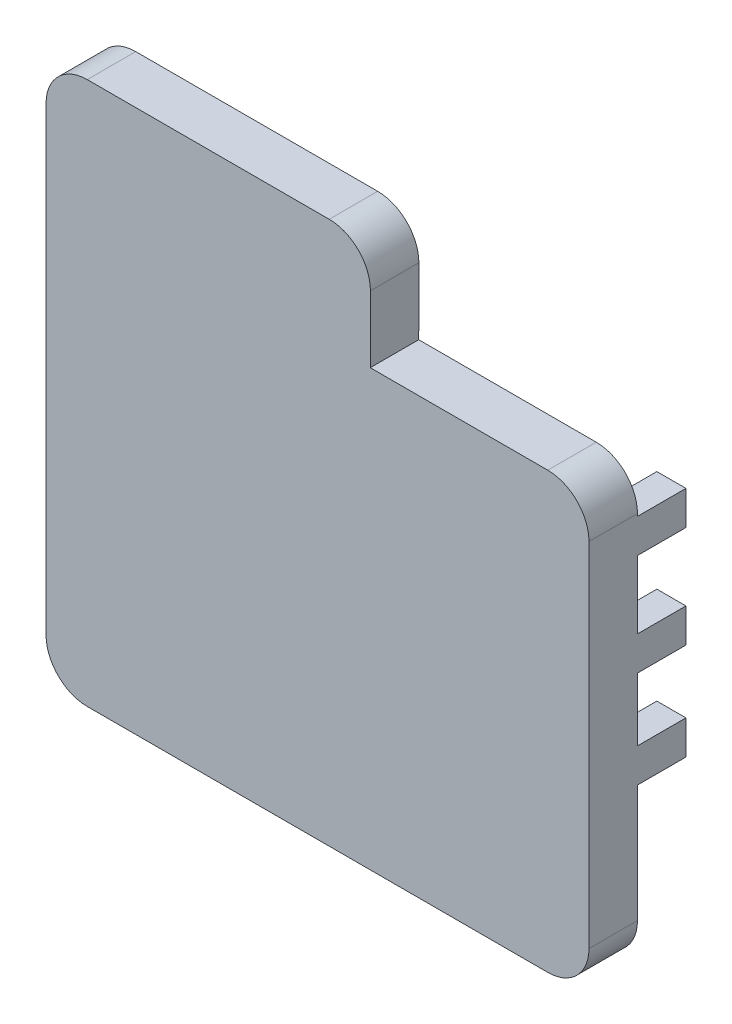
ISO-10303-21;
HEADER;
FILE_DESCRIPTION(('STEP AP214'),'2;1');
FILE_NAME('part.step','',(''),(''),'','','');
FILE_SCHEMA(('AUTOMOTIVE_DESIGN { 1 0 10303 214 1 1 1 1 }'));
ENDSEC;
DATA;
#1=APPLICATION_CONTEXT('core data for automotive mechanical design processes');
#2=APPLICATION_PROTOCOL_DEFINITION('international standard','automotive_design',2000,#1);
#3=PRODUCT_CONTEXT('',#1,'mechanical');
#4=PRODUCT('Part','Part','',(#3));
#5=PRODUCT_RELATED_PRODUCT_CATEGORY('part','',(#4));
#6=PRODUCT_DEFINITION_FORMATION('','',#4);
#7=PRODUCT_DEFINITION_CONTEXT('part definition',#1,'design');
#8=PRODUCT_DEFINITION('design','',#6,#7);
#9=PRODUCT_DEFINITION_SHAPE('','',#8);
#10=(LENGTH_UNIT() NAMED_UNIT(*) SI_UNIT(.MILLI.,.METRE.));
#11=(NAMED_UNIT(*) PLANE_ANGLE_UNIT() SI_UNIT($,.RADIAN.));
#12=(NAMED_UNIT(*) SI_UNIT($,.STERADIAN.) SOLID_ANGLE_UNIT());
#13=UNCERTAINTY_MEASURE_WITH_UNIT(LENGTH_MEASURE(1.E-05),#10,'distance_accuracy_value','');
#14=(GEOMETRIC_REPRESENTATION_CONTEXT(3) GLOBAL_UNCERTAINTY_ASSIGNED_CONTEXT((#13)) GLOBAL_UNIT_ASSIGNED_CONTEXT((#10,
#11,#12)) REPRESENTATION_CONTEXT('',''));
#15=CARTESIAN_POINT('',(0.,0.,0.));
#16=DIRECTION('',(0.,0.,1.));
#17=DIRECTION('',(1.,0.,0.));
#18=AXIS2_PLACEMENT_3D('',#15,#16,#17);
#19=CARTESIAN_POINT('',(0.,0.,0.));
#20=DIRECTION('',(0.,0.,1.));
#21=DIRECTION('',(1.,0.,0.));
#22=AXIS2_PLACEMENT_3D('',#19,#20,#21);
#23=PLANE('',#22);
#24=DIRECTION('',(-1.,0.,0.));
#25=VECTOR('',#24,1.);
#26=CARTESIAN_POINT('',(0.,134.012885516007,0.));
#27=LINE('',#26,#25);
#28=CARTESIAN_POINT('',(-17.5227775261524,134.012885516007,0.));
#29=VERTEX_POINT('',#28);
#30=CARTESIAN_POINT('',(-23.5227775261524,134.012885516007,0.));
#31=VERTEX_POINT('',#30);
#32=EDGE_CURVE('E55',#29,#31,#27,.T.);
#33=ORIENTED_EDGE('',*,*,#32,.F.);
#34=DIRECTION('',(0.,1.,0.));
#35=VECTOR('',#34,1.);
#36=CARTESIAN_POINT('',(-17.5227775261524,0.,0.));
#37=LINE('',#36,#35);
#38=CARTESIAN_POINT('',(-17.5227775261524,141.012885516007,0.));
#39=VERTEX_POINT('',#38);
#40=EDGE_CURVE('E279',#29,#39,#37,.T.);
#41=ORIENTED_EDGE('',*,*,#40,.T.);
#42=DIRECTION('',(-1.,0.,0.));
#43=VECTOR('',#42,1.);
#44=CARTESIAN_POINT('',(0.,141.012885516007,0.));
#45=LINE('',#44,#43);
#46=CARTESIAN_POINT('',(-23.5227775261524,141.012885516007,0.));
#47=VERTEX_POINT('',#46);
#48=EDGE_CURVE('E249',#39,#47,#45,.T.);
#49=ORIENTED_EDGE('',*,*,#48,.T.);
#50=DIRECTION('',(0.,-1.,0.));
#51=VECTOR('',#50,1.);
#52=CARTESIAN_POINT('',(-23.5227775261524,0.,0.));
#53=LINE('',#52,#51);
#54=CARTESIAN_POINT('',(-23.5227775261524,166.512885516007,0.));
#55=VERTEX_POINT('',#54);
#56=EDGE_CURVE('E515',#55,#47,#53,.T.);
#57=ORIENTED_EDGE('',*,*,#56,.F.);
#58=CARTESIAN_POINT('',(-15.0227775261524,166.512885516006,0.));
#59=DIRECTION('',(0.,0.,1.));
#60=DIRECTION('',(1.,0.,0.));
#61=AXIS2_PLACEMENT_3D('',#58,#59,#60);
#62=CIRCLE('',#61,8.50000000000013);
#63=CARTESIAN_POINT('',(-15.0227775261524,175.012885516007,0.));
#64=VERTEX_POINT('',#63);
#65=EDGE_CURVE('E511',#64,#55,#62,.T.);
#66=ORIENTED_EDGE('',*,*,#65,.F.);
#67=DIRECTION('',(-1.,0.,0.));
#68=VECTOR('',#67,1.);
#69=CARTESIAN_POINT('',(0.,175.012885516007,0.));
#70=LINE('',#69,#68);
#71=CARTESIAN_POINT('',(34.8872224738476,175.012885516007,0.));
#72=VERTEX_POINT('',#71);
#73=EDGE_CURVE('E508',#72,#64,#70,.T.);
#74=ORIENTED_EDGE('',*,*,#73,.F.);
#75=CARTESIAN_POINT('',(34.8872224738476,166.512885516007,0.));
#76=DIRECTION('',(0.,0.,1.));
#77=DIRECTION('',(1.,0.,0.));
#78=AXIS2_PLACEMENT_3D('',#75,#76,#77);
#79=CIRCLE('',#78,8.50000000000001);
#80=CARTESIAN_POINT('',(43.3871995950795,166.493163991363,0.));
#81=VERTEX_POINT('',#80);
#82=EDGE_CURVE('E505',#81,#72,#79,.T.);
#83=ORIENTED_EDGE('',*,*,#82,.F.);
#84=DIRECTION('',(0.00232017936979203,0.999997308380224,0.));
#85=VECTOR('',#84,1.);
#86=CARTESIAN_POINT('',(43.0006730671573,-0.0997695430792654,0.));
#87=LINE('',#86,#85);
#88=CARTESIAN_POINT('',(43.3552731949046,152.732885516007,0.));
#89=VERTEX_POINT('',#88);
#90=EDGE_CURVE('E502',#89,#81,#87,.T.);
#91=ORIENTED_EDGE('',*,*,#90,.F.);
#92=DIRECTION('',(-1.,0.,0.));
#93=VECTOR('',#92,1.);
#94=CARTESIAN_POINT('',(0.,152.732885516007,0.));
#95=LINE('',#94,#93);
#96=CARTESIAN_POINT('',(79.9772224738476,152.732885516007,0.));
#97=VERTEX_POINT('',#96);
#98=EDGE_CURVE('E499',#97,#89,#95,.T.);
#99=ORIENTED_EDGE('',*,*,#98,.F.);
#100=CARTESIAN_POINT('',(79.9772224738476,144.232885516007,0.));
#101=DIRECTION('',(0.,0.,1.));
#102=DIRECTION('',(1.,0.,0.));
#103=AXIS2_PLACEMENT_3D('',#100,#101,#102);
#104=CIRCLE('',#103,8.49999999999991);
#105=CARTESIAN_POINT('',(88.4772224738476,144.232885516007,0.));
#106=VERTEX_POINT('',#105);
#107=EDGE_CURVE('E495',#106,#97,#104,.T.);
#108=ORIENTED_EDGE('',*,*,#107,.F.);
#109=DIRECTION('',(0.,1.,0.));
#110=VECTOR('',#109,1.);
#111=CARTESIAN_POINT('',(88.4772224738476,0.,0.));
#112=LINE('',#111,#110);
#113=CARTESIAN_POINT('',(88.4772224738476,143.732885516007,0.));
#114=VERTEX_POINT('',#113);
#115=EDGE_CURVE('E490',#114,#106,#112,.T.);
#116=ORIENTED_EDGE('',*,*,#115,.F.);
#117=DIRECTION('',(-1.,0.,0.));
#118=VECTOR('',#117,1.);
#119=CARTESIAN_POINT('',(0.,143.732885516007,0.));
#120=LINE('',#119,#118);
#121=CARTESIAN_POINT('',(82.4772224738476,143.732885516007,0.));
#122=VERTEX_POINT('',#121);
#123=EDGE_CURVE('E399',#114,#122,#120,.T.);
#124=ORIENTED_EDGE('',*,*,#123,.T.);
#125=DIRECTION('',(0.,-1.,0.));
#126=VECTOR('',#125,1.);
#127=CARTESIAN_POINT('',(82.4772224738476,0.,0.));
#128=LINE('',#127,#126);
#129=CARTESIAN_POINT('',(82.4772224738476,136.732885516007,0.));
#130=VERTEX_POINT('',#129);
#131=EDGE_CURVE('E431',#122,#130,#128,.T.);
#132=ORIENTED_EDGE('',*,*,#131,.T.);
#133=DIRECTION('',(1.,0.,0.));
#134=VECTOR('',#133,1.);
#135=CARTESIAN_POINT('',(0.,136.732885516007,0.));
#136=LINE('',#135,#134);
#137=CARTESIAN_POINT('',(88.4772224738476,136.732885516007,0.));
#138=VERTEX_POINT('',#137);
#139=EDGE_CURVE('E415',#130,#138,#136,.T.);
#140=ORIENTED_EDGE('',*,*,#139,.T.);
#141=CARTESIAN_POINT('',(88.4772224738476,122.732885516007,0.));
#142=VERTEX_POINT('',#141);
#143=EDGE_CURVE('E609',#142,#138,#112,.T.);
#144=ORIENTED_EDGE('',*,*,#143,.F.);
#145=DIRECTION('',(1.,0.,0.));
#146=VECTOR('',#145,1.);
#147=CARTESIAN_POINT('',(0.,122.732885516007,0.));
#148=LINE('',#147,#146);
#149=CARTESIAN_POINT('',(82.4772224738476,122.732885516007,0.));
#150=VERTEX_POINT('',#149);
#151=EDGE_CURVE('E390',#150,#142,#148,.T.);
#152=ORIENTED_EDGE('',*,*,#151,.F.);
#153=DIRECTION('',(0.,-1.,0.));
#154=VECTOR('',#153,1.);
#155=CARTESIAN_POINT('',(82.4772224738476,0.,0.));
#156=LINE('',#155,#154);
#157=CARTESIAN_POINT('',(82.4772224738476,115.732885516007,0.));
#158=VERTEX_POINT('',#157);
#159=EDGE_CURVE('E375',#150,#158,#156,.T.);
#160=ORIENTED_EDGE('',*,*,#159,.T.);
#161=DIRECTION('',(1.,0.,0.));
#162=VECTOR('',#161,1.);
#163=CARTESIAN_POINT('',(0.,115.732885516007,0.));
#164=LINE('',#163,#162);
#165=CARTESIAN_POINT('',(88.4772224738476,115.732885516007,0.));
#166=VERTEX_POINT('',#165);
#167=EDGE_CURVE('E360',#158,#166,#164,.T.);
#168=ORIENTED_EDGE('',*,*,#167,.T.);
#169=CARTESIAN_POINT('',(88.4772224738476,102.732885516007,0.));
#170=VERTEX_POINT('',#169);
#171=EDGE_CURVE('E496',#170,#166,#112,.T.);
#172=ORIENTED_EDGE('',*,*,#171,.F.);
#173=DIRECTION('',(1.,0.,0.));
#174=VECTOR('',#173,1.);
#175=CARTESIAN_POINT('',(0.,102.732885516007,0.));
#176=LINE('',#175,#174);
#177=CARTESIAN_POINT('',(82.4772224738476,102.732885516007,0.));
#178=VERTEX_POINT('',#177);
#179=EDGE_CURVE('E351',#178,#170,#176,.T.);
#180=ORIENTED_EDGE('',*,*,#179,.F.);
#181=DIRECTION('',(0.,-1.,0.));
#182=VECTOR('',#181,1.);
#183=CARTESIAN_POINT('',(82.4772224738476,0.,0.));
#184=LINE('',#183,#182);
#185=CARTESIAN_POINT('',(82.4772224738476,95.7328855160066,0.));
#186=VERTEX_POINT('',#185);
#187=EDGE_CURVE('E336',#178,#186,#184,.T.);
#188=ORIENTED_EDGE('',*,*,#187,.T.);
#189=DIRECTION('',(1.,0.,0.));
#190=VECTOR('',#189,1.);
#191=CARTESIAN_POINT('',(0.,95.7328855160066,0.));
#192=LINE('',#191,#190);
#193=CARTESIAN_POINT('',(88.4772224738476,95.7328855160066,0.));
#194=VERTEX_POINT('',#193);
#195=EDGE_CURVE('E322',#186,#194,#192,.T.);
#196=ORIENTED_EDGE('',*,*,#195,.T.);
#197=CARTESIAN_POINT('',(88.4772224738476,71.5128855160066,0.));
#198=VERTEX_POINT('',#197);
#199=EDGE_CURVE('E491',#198,#194,#112,.T.);
#200=ORIENTED_EDGE('',*,*,#199,.F.);
#201=CARTESIAN_POINT('',(79.9772224738476,71.5128855160068,0.));
#202=DIRECTION('',(0.,0.,1.));
#203=DIRECTION('',(1.,0.,0.));
#204=AXIS2_PLACEMENT_3D('',#201,#202,#203);
#205=CIRCLE('',#204,8.50000000000008);
#206=CARTESIAN_POINT('',(79.9772224738476,63.0128855160066,0.));
#207=VERTEX_POINT('',#206);
#208=EDGE_CURVE('E442',#207,#198,#205,.T.);
#209=ORIENTED_EDGE('',*,*,#208,.F.);
#210=DIRECTION('',(1.,0.,0.));
#211=VECTOR('',#210,1.);
#212=CARTESIAN_POINT('',(0.,63.0128855160066,0.));
#213=LINE('',#212,#211);
#214=CARTESIAN_POINT('',(-15.0227775261524,63.0128855160066,0.));
#215=VERTEX_POINT('',#214);
#216=EDGE_CURVE('E456',#215,#207,#213,.T.);
#217=ORIENTED_EDGE('',*,*,#216,.F.);
#218=CARTESIAN_POINT('',(-15.0227775261524,71.5128855160068,0.));
#219=DIRECTION('',(0.,0.,1.));
#220=DIRECTION('',(1.,0.,0.));
#221=AXIS2_PLACEMENT_3D('',#218,#219,#220);
#222=CIRCLE('',#221,8.50000000000011);
#223=CARTESIAN_POINT('',(-23.5227775261524,71.5128855160066,0.));
#224=VERTEX_POINT('',#223);
#225=EDGE_CURVE('E519',#224,#215,#222,.T.);
#226=ORIENTED_EDGE('',*,*,#225,.F.);
#227=CARTESIAN_POINT('',(-23.5227775261524,97.5128855160066,0.));
#228=VERTEX_POINT('',#227);
#229=EDGE_CURVE('E514',#228,#224,#53,.T.);
#230=ORIENTED_EDGE('',*,*,#229,.F.);
#231=DIRECTION('',(-1.,0.,0.));
#232=VECTOR('',#231,1.);
#233=CARTESIAN_POINT('',(0.,97.5128855160066,0.));
#234=LINE('',#233,#232);
#235=CARTESIAN_POINT('',(-17.5227775261524,97.5128855160066,0.));
#236=VERTEX_POINT('',#235);
#237=EDGE_CURVE('E297',#236,#228,#234,.T.);
#238=ORIENTED_EDGE('',*,*,#237,.F.);
#239=DIRECTION('',(0.,1.,0.));
#240=VECTOR('',#239,1.);
#241=CARTESIAN_POINT('',(-17.5227775261524,0.,0.));
#242=LINE('',#241,#240);
#243=CARTESIAN_POINT('',(-17.5227775261524,104.512885516007,0.));
#244=VERTEX_POINT('',#243);
#245=EDGE_CURVE('E286',#236,#244,#242,.T.);
#246=ORIENTED_EDGE('',*,*,#245,.T.);
#247=DIRECTION('',(-1.,0.,0.));
#248=VECTOR('',#247,1.);
#249=CARTESIAN_POINT('',(0.,104.512885516007,0.));
#250=LINE('',#249,#248);
#251=CARTESIAN_POINT('',(-23.5227775261524,104.512885516007,0.));
#252=VERTEX_POINT('',#251);
#253=EDGE_CURVE('E312',#244,#252,#250,.T.);
#254=ORIENTED_EDGE('',*,*,#253,.T.);
#255=EDGE_CURVE('E62',#31,#252,#53,.T.);
#256=ORIENTED_EDGE('',*,*,#255,.F.);
#257=EDGE_LOOP('',(#33,#41,#49,#57,#66,#74,#83,#91,#99,#108,#116,#124,#132,#140,#144,#152,#160,
#168,#172,#180,#188,#196,#200,#209,#217,#226,#230,#238,#246,#254,#256));
#258=FACE_BOUND('',#257,.T.);
#259=ADVANCED_FACE('F39',(#258),#23,.F.);
#260=CARTESIAN_POINT('',(79.9772224738476,71.5128855160068,10.));
#261=DIRECTION('',(0.,0.,-1.));
#262=DIRECTION('',(-1.,0.,0.));
#263=AXIS2_PLACEMENT_3D('',#260,#261,#262);
#264=CYLINDRICAL_SURFACE('',#263,8.50000000000008);
#265=ORIENTED_EDGE('',*,*,#208,.T.);
#266=DIRECTION('',(0.,0.,-1.));
#267=VECTOR('',#266,1.);
#268=CARTESIAN_POINT('',(88.4772224738476,71.5128855160066,10.));
#269=LINE('',#268,#267);
#270=CARTESIAN_POINT('',(88.4772224738476,71.5128855160066,10.));
#271=VERTEX_POINT('',#270);
#272=EDGE_CURVE('E11',#271,#198,#269,.T.);
#273=ORIENTED_EDGE('',*,*,#272,.F.);
#274=CARTESIAN_POINT('',(79.9772224738476,71.5128855160068,10.));
#275=DIRECTION('',(0.,0.,1.));
#276=DIRECTION('',(1.,0.,0.));
#277=AXIS2_PLACEMENT_3D('',#274,#275,#276);
#278=CIRCLE('',#277,8.50000000000008);
#279=CARTESIAN_POINT('',(79.9772224738476,63.0128855160066,10.));
#280=VERTEX_POINT('',#279);
#281=EDGE_CURVE('E451',#280,#271,#278,.T.);
#282=ORIENTED_EDGE('',*,*,#281,.F.);
#283=DIRECTION('',(0.,0.,-1.));
#284=VECTOR('',#283,1.);
#285=CARTESIAN_POINT('',(79.9772224738476,63.0128855160066,10.));
#286=LINE('',#285,#284);
#287=EDGE_CURVE('E486',#280,#207,#286,.T.);
#288=ORIENTED_EDGE('',*,*,#287,.T.);
#289=EDGE_LOOP('',(#265,#273,#282,#288));
#290=FACE_BOUND('',#289,.T.);
#291=ADVANCED_FACE('F41',(#290),#264,.T.);
#292=CARTESIAN_POINT('',(88.4772224738476,0.,10.));
#293=DIRECTION('',(-1.,0.,0.));
#294=DIRECTION('',(0.,0.,1.));
#295=AXIS2_PLACEMENT_3D('',#292,#293,#294);
#296=PLANE('',#295);
#297=ORIENTED_EDGE('',*,*,#199,.T.);
#298=DIRECTION('',(0.,0.,1.));
#299=VECTOR('',#298,1.);
#300=CARTESIAN_POINT('',(88.4772224738476,95.7328855160066,-10.));
#301=LINE('',#300,#299);
#302=CARTESIAN_POINT('',(88.4772224738476,95.7328855160066,-10.));
#303=VERTEX_POINT('',#302);
#304=EDGE_CURVE('E347',#303,#194,#301,.T.);
#305=ORIENTED_EDGE('',*,*,#304,.F.);
#306=DIRECTION('',(0.,1.,0.));
#307=VECTOR('',#306,1.);
#308=CARTESIAN_POINT('',(88.4772224738476,0.,-10.));
#309=LINE('',#308,#307);
#310=CARTESIAN_POINT('',(88.4772224738476,102.732885516007,-10.));
#311=VERTEX_POINT('',#310);
#312=EDGE_CURVE('E335',#303,#311,#309,.T.);
#313=ORIENTED_EDGE('',*,*,#312,.T.);
#314=DIRECTION('',(0.,0.,1.));
#315=VECTOR('',#314,1.);
#316=CARTESIAN_POINT('',(88.4772224738476,102.732885516007,-10.));
#317=LINE('',#316,#315);
#318=EDGE_CURVE('E364',#311,#170,#317,.T.);
#319=ORIENTED_EDGE('',*,*,#318,.T.);
#320=ORIENTED_EDGE('',*,*,#171,.T.);
#321=DIRECTION('',(0.,0.,1.));
#322=VECTOR('',#321,1.);
#323=CARTESIAN_POINT('',(88.4772224738476,115.732885516007,-10.));
#324=LINE('',#323,#322);
#325=CARTESIAN_POINT('',(88.4772224738476,115.732885516007,-10.));
#326=VERTEX_POINT('',#325);
#327=EDGE_CURVE('E386',#326,#166,#324,.T.);
#328=ORIENTED_EDGE('',*,*,#327,.F.);
#329=DIRECTION('',(0.,1.,0.));
#330=VECTOR('',#329,1.);
#331=CARTESIAN_POINT('',(88.4772224738476,0.,-10.));
#332=LINE('',#331,#330);
#333=CARTESIAN_POINT('',(88.4772224738476,122.732885516007,-10.));
#334=VERTEX_POINT('',#333);
#335=EDGE_CURVE('E374',#326,#334,#332,.T.);
#336=ORIENTED_EDGE('',*,*,#335,.T.);
#337=DIRECTION('',(0.,0.,1.));
#338=VECTOR('',#337,1.);
#339=CARTESIAN_POINT('',(88.4772224738476,122.732885516007,-10.));
#340=LINE('',#339,#338);
#341=EDGE_CURVE('E403',#334,#142,#340,.T.);
#342=ORIENTED_EDGE('',*,*,#341,.T.);
#343=ORIENTED_EDGE('',*,*,#143,.T.);
#344=DIRECTION('',(0.,0.,1.));
#345=VECTOR('',#344,1.);
#346=CARTESIAN_POINT('',(88.4772224738476,136.732885516007,-10.));
#347=LINE('',#346,#345);
#348=CARTESIAN_POINT('',(88.4772224738476,136.732885516007,-10.));
#349=VERTEX_POINT('',#348);
#350=EDGE_CURVE('E438',#349,#138,#347,.T.);
#351=ORIENTED_EDGE('',*,*,#350,.F.);
#352=DIRECTION('',(0.,1.,0.));
#353=VECTOR('',#352,1.);
#354=CARTESIAN_POINT('',(88.4772224738476,0.,-10.));
#355=LINE('',#354,#353);
#356=CARTESIAN_POINT('',(88.4772224738476,143.732885516007,-10.));
#357=VERTEX_POINT('',#356);
#358=EDGE_CURVE('E410',#349,#357,#355,.T.);
#359=ORIENTED_EDGE('',*,*,#358,.T.);
#360=DIRECTION('',(0.,0.,1.));
#361=VECTOR('',#360,1.);
#362=CARTESIAN_POINT('',(88.4772224738476,143.732885516007,-10.));
#363=LINE('',#362,#361);
#364=EDGE_CURVE('E427',#357,#114,#363,.T.);
#365=ORIENTED_EDGE('',*,*,#364,.T.);
#366=ORIENTED_EDGE('',*,*,#115,.T.);
#367=DIRECTION('',(0.,0.,-1.));
#368=VECTOR('',#367,1.);
#369=CARTESIAN_POINT('',(88.4772224738476,144.232885516007,10.));
#370=LINE('',#369,#368);
#371=CARTESIAN_POINT('',(88.4772224738476,144.232885516007,10.));
#372=VERTEX_POINT('',#371);
#373=EDGE_CURVE('E48',#372,#106,#370,.T.);
#374=ORIENTED_EDGE('',*,*,#373,.F.);
#375=DIRECTION('',(0.,1.,0.));
#376=VECTOR('',#375,1.);
#377=CARTESIAN_POINT('',(88.4772224738476,0.,10.));
#378=LINE('',#377,#376);
#379=EDGE_CURVE('E455',#271,#372,#378,.T.);
#380=ORIENTED_EDGE('',*,*,#379,.F.);
#381=ORIENTED_EDGE('',*,*,#272,.T.);
#382=EDGE_LOOP('',(#297,#305,#313,#319,#320,#328,#336,#342,#343,#351,#359,#365,#366,#374,#380,#381));
#383=FACE_BOUND('',#382,.T.);
#384=ADVANCED_FACE('F586',(#383),#296,.F.);
#385=CARTESIAN_POINT('',(79.9772224738476,144.232885516007,10.));
#386=DIRECTION('',(0.,0.,-1.));
#387=DIRECTION('',(-1.,0.,0.));
#388=AXIS2_PLACEMENT_3D('',#385,#386,#387);
#389=CYLINDRICAL_SURFACE('',#388,8.49999999999991);
#390=ORIENTED_EDGE('',*,*,#107,.T.);
#391=DIRECTION('',(0.,0.,-1.));
#392=VECTOR('',#391,1.);
#393=CARTESIAN_POINT('',(79.9772224738476,152.732885516007,10.));
#394=LINE('',#393,#392);
#395=CARTESIAN_POINT('',(79.9772224738476,152.732885516007,10.));
#396=VERTEX_POINT('',#395);
#397=EDGE_CURVE('E555',#396,#97,#394,.T.);
#398=ORIENTED_EDGE('',*,*,#397,.F.);
#399=CARTESIAN_POINT('',(79.9772224738476,144.232885516007,10.));
#400=DIRECTION('',(0.,0.,1.));
#401=DIRECTION('',(1.,0.,0.));
#402=AXIS2_PLACEMENT_3D('',#399,#400,#401);
#403=CIRCLE('',#402,8.49999999999991);
#404=EDGE_CURVE('E459',#372,#396,#403,.T.);
#405=ORIENTED_EDGE('',*,*,#404,.F.);
#406=ORIENTED_EDGE('',*,*,#373,.T.);
#407=EDGE_LOOP('',(#390,#398,#405,#406));
#408=FACE_BOUND('',#407,.T.);
#409=ADVANCED_FACE('F564',(#408),#389,.T.);
#410=CARTESIAN_POINT('',(0.,152.732885516007,10.));
#411=DIRECTION('',(0.,-1.,0.));
#412=DIRECTION('',(0.,0.,-1.));
#413=AXIS2_PLACEMENT_3D('',#410,#411,#412);
#414=PLANE('',#413);
#415=ORIENTED_EDGE('',*,*,#98,.T.);
#416=DIRECTION('',(0.,0.,-1.));
#417=VECTOR('',#416,1.);
#418=CARTESIAN_POINT('',(43.3552731949046,152.732885516007,10.));
#419=LINE('',#418,#417);
#420=CARTESIAN_POINT('',(43.3552731949046,152.732885516007,10.));
#421=VERTEX_POINT('',#420);
#422=EDGE_CURVE('E551',#421,#89,#419,.T.);
#423=ORIENTED_EDGE('',*,*,#422,.F.);
#424=DIRECTION('',(-1.,0.,0.));
#425=VECTOR('',#424,1.);
#426=CARTESIAN_POINT('',(0.,152.732885516007,10.));
#427=LINE('',#426,#425);
#428=EDGE_CURVE('E462',#396,#421,#427,.T.);
#429=ORIENTED_EDGE('',*,*,#428,.F.);
#430=ORIENTED_EDGE('',*,*,#397,.T.);
#431=EDGE_LOOP('',(#415,#423,#429,#430));
#432=FACE_BOUND('',#431,.T.);
#433=ADVANCED_FACE('F574',(#432),#414,.F.);
#434=CARTESIAN_POINT('',(43.0006730671573,-0.0997695430792654,10.));
#435=DIRECTION('',(-0.999997308380224,0.00232017936979203,0.));
#436=DIRECTION('',(-0.00232017936979203,-0.999997308380224,0.));
#437=AXIS2_PLACEMENT_3D('',#434,#435,#436);
#438=PLANE('',#437);
#439=ORIENTED_EDGE('',*,*,#90,.T.);
#440=DIRECTION('',(0.,0.,-1.));
#441=VECTOR('',#440,1.);
#442=CARTESIAN_POINT('',(43.3871995950795,166.493163991363,10.));
#443=LINE('',#442,#441);
#444=CARTESIAN_POINT('',(43.3871995950795,166.493163991363,10.));
#445=VERTEX_POINT('',#444);
#446=EDGE_CURVE('E547',#445,#81,#443,.T.);
#447=ORIENTED_EDGE('',*,*,#446,.F.);
#448=DIRECTION('',(0.00232017936979203,0.999997308380224,0.));
#449=VECTOR('',#448,1.);
#450=CARTESIAN_POINT('',(43.0006730671573,-0.0997695430792654,10.));
#451=LINE('',#450,#449);
#452=EDGE_CURVE('E465',#421,#445,#451,.T.);
#453=ORIENTED_EDGE('',*,*,#452,.F.);
#454=ORIENTED_EDGE('',*,*,#422,.T.);
#455=EDGE_LOOP('',(#439,#447,#453,#454));
#456=FACE_BOUND('',#455,.T.);
#457=ADVANCED_FACE('F578',(#456),#438,.F.);
#458=CARTESIAN_POINT('',(34.8872224738476,166.512885516007,10.));
#459=DIRECTION('',(0.,0.,-1.));
#460=DIRECTION('',(-1.,0.,0.));
#461=AXIS2_PLACEMENT_3D('',#458,#459,#460);
#462=CYLINDRICAL_SURFACE('',#461,8.50000000000001);
#463=ORIENTED_EDGE('',*,*,#82,.T.);
#464=DIRECTION('',(0.,0.,-1.));
#465=VECTOR('',#464,1.);
#466=CARTESIAN_POINT('',(34.8872224738476,175.012885516007,10.));
#467=LINE('',#466,#465);
#468=CARTESIAN_POINT('',(34.8872224738476,175.012885516007,10.));
#469=VERTEX_POINT('',#468);
#470=EDGE_CURVE('E543',#469,#72,#467,.T.);
#471=ORIENTED_EDGE('',*,*,#470,.F.);
#472=CARTESIAN_POINT('',(34.8872224738476,166.512885516007,10.));
#473=DIRECTION('',(0.,0.,1.));
#474=DIRECTION('',(1.,0.,0.));
#475=AXIS2_PLACEMENT_3D('',#472,#473,#474);
#476=CIRCLE('',#475,8.50000000000001);
#477=EDGE_CURVE('E468',#445,#469,#476,.T.);
#478=ORIENTED_EDGE('',*,*,#477,.F.);
#479=ORIENTED_EDGE('',*,*,#446,.T.);
#480=EDGE_LOOP('',(#463,#471,#478,#479));
#481=FACE_BOUND('',#480,.T.);
#482=ADVANCED_FACE('F665',(#481),#462,.T.);
#483=CARTESIAN_POINT('',(0.,175.012885516007,10.));
#484=DIRECTION('',(0.,-1.,0.));
#485=DIRECTION('',(0.,0.,-1.));
#486=AXIS2_PLACEMENT_3D('',#483,#484,#485);
#487=PLANE('',#486);
#488=ORIENTED_EDGE('',*,*,#73,.T.);
#489=DIRECTION('',(0.,0.,-1.));
#490=VECTOR('',#489,1.);
#491=CARTESIAN_POINT('',(-15.0227775261524,175.012885516007,10.));
#492=LINE('',#491,#490);
#493=CARTESIAN_POINT('',(-15.0227775261524,175.012885516007,10.));
#494=VERTEX_POINT('',#493);
#495=EDGE_CURVE('E539',#494,#64,#492,.T.);
#496=ORIENTED_EDGE('',*,*,#495,.F.);
#497=DIRECTION('',(-1.,0.,0.));
#498=VECTOR('',#497,1.);
#499=CARTESIAN_POINT('',(0.,175.012885516007,10.));
#500=LINE('',#499,#498);
#501=EDGE_CURVE('E471',#469,#494,#500,.T.);
#502=ORIENTED_EDGE('',*,*,#501,.F.);
#503=ORIENTED_EDGE('',*,*,#470,.T.);
#504=EDGE_LOOP('',(#488,#496,#502,#503));
#505=FACE_BOUND('',#504,.T.);
#506=ADVANCED_FACE('F661',(#505),#487,.F.);
#507=CARTESIAN_POINT('',(-15.0227775261524,166.512885516006,10.));
#508=DIRECTION('',(0.,0.,-1.));
#509=DIRECTION('',(-1.,0.,0.));
#510=AXIS2_PLACEMENT_3D('',#507,#508,#509);
#511=CYLINDRICAL_SURFACE('',#510,8.50000000000013);
#512=ORIENTED_EDGE('',*,*,#65,.T.);
#513=DIRECTION('',(0.,0.,-1.));
#514=VECTOR('',#513,1.);
#515=CARTESIAN_POINT('',(-23.5227775261524,166.512885516007,10.));
#516=LINE('',#515,#514);
#517=CARTESIAN_POINT('',(-23.5227775261524,166.512885516007,10.));
#518=VERTEX_POINT('',#517);
#519=EDGE_CURVE('E535',#518,#55,#516,.T.);
#520=ORIENTED_EDGE('',*,*,#519,.F.);
#521=CARTESIAN_POINT('',(-15.0227775261524,166.512885516006,10.));
#522=DIRECTION('',(0.,0.,1.));
#523=DIRECTION('',(1.,0.,0.));
#524=AXIS2_PLACEMENT_3D('',#521,#522,#523);
#525=CIRCLE('',#524,8.50000000000013);
#526=EDGE_CURVE('E474',#494,#518,#525,.T.);
#527=ORIENTED_EDGE('',*,*,#526,.F.);
#528=ORIENTED_EDGE('',*,*,#495,.T.);
#529=EDGE_LOOP('',(#512,#520,#527,#528));
#530=FACE_BOUND('',#529,.T.);
#531=ADVANCED_FACE('F658',(#530),#511,.T.);
#532=CARTESIAN_POINT('',(-23.5227775261524,0.,10.));
#533=DIRECTION('',(1.,0.,0.));
#534=DIRECTION('',(0.,0.,-1.));
#535=AXIS2_PLACEMENT_3D('',#532,#533,#534);
#536=PLANE('',#535);
#537=ORIENTED_EDGE('',*,*,#56,.T.);
#538=DIRECTION('',(0.,0.,1.));
#539=VECTOR('',#538,1.);
#540=CARTESIAN_POINT('',(-23.5227775261524,141.012885516007,-10.));
#541=LINE('',#540,#539);
#542=CARTESIAN_POINT('',(-23.5227775261524,141.012885516007,-10.));
#543=VERTEX_POINT('',#542);
#544=EDGE_CURVE('E255',#543,#47,#541,.T.);
#545=ORIENTED_EDGE('',*,*,#544,.F.);
#546=DIRECTION('',(0.,-1.,0.));
#547=VECTOR('',#546,1.);
#548=CARTESIAN_POINT('',(-23.5227775261524,0.,-10.));
#549=LINE('',#548,#547);
#550=CARTESIAN_POINT('',(-23.5227775261524,134.012885516007,-10.));
#551=VERTEX_POINT('',#550);
#552=EDGE_CURVE('E264',#543,#551,#549,.T.);
#553=ORIENTED_EDGE('',*,*,#552,.T.);
#554=DIRECTION('',(0.,0.,1.));
#555=VECTOR('',#554,1.);
#556=CARTESIAN_POINT('',(-23.5227775261524,134.012885516007,-10.));
#557=LINE('',#556,#555);
#558=EDGE_CURVE('E287',#551,#31,#557,.T.);
#559=ORIENTED_EDGE('',*,*,#558,.T.);
#560=ORIENTED_EDGE('',*,*,#255,.T.);
#561=DIRECTION('',(0.,0.,1.));
#562=VECTOR('',#561,1.);
#563=CARTESIAN_POINT('',(-23.5227775261524,104.512885516007,-10.));
#564=LINE('',#563,#562);
#565=CARTESIAN_POINT('',(-23.5227775261524,104.512885516007,-10.));
#566=VERTEX_POINT('',#565);
#567=EDGE_CURVE('E326',#566,#252,#564,.T.);
#568=ORIENTED_EDGE('',*,*,#567,.F.);
#569=DIRECTION('',(0.,-1.,0.));
#570=VECTOR('',#569,1.);
#571=CARTESIAN_POINT('',(-23.5227775261524,0.,-10.));
#572=LINE('',#571,#570);
#573=CARTESIAN_POINT('',(-23.5227775261524,97.5128855160066,-10.));
#574=VERTEX_POINT('',#573);
#575=EDGE_CURVE('E301',#566,#574,#572,.T.);
#576=ORIENTED_EDGE('',*,*,#575,.T.);
#577=DIRECTION('',(0.,0.,1.));
#578=VECTOR('',#577,1.);
#579=CARTESIAN_POINT('',(-23.5227775261524,97.5128855160066,-10.));
#580=LINE('',#579,#578);
#581=EDGE_CURVE('E323',#574,#228,#580,.T.);
#582=ORIENTED_EDGE('',*,*,#581,.T.);
#583=ORIENTED_EDGE('',*,*,#229,.T.);
#584=DIRECTION('',(0.,0.,-1.));
#585=VECTOR('',#584,1.);
#586=CARTESIAN_POINT('',(-23.5227775261524,71.5128855160066,10.));
#587=LINE('',#586,#585);
#588=CARTESIAN_POINT('',(-23.5227775261524,71.5128855160066,10.));
#589=VERTEX_POINT('',#588);
#590=EDGE_CURVE('E531',#589,#224,#587,.T.);
#591=ORIENTED_EDGE('',*,*,#590,.F.);
#592=DIRECTION('',(0.,-1.,0.));
#593=VECTOR('',#592,1.);
#594=CARTESIAN_POINT('',(-23.5227775261524,0.,10.));
#595=LINE('',#594,#593);
#596=EDGE_CURVE('E477',#518,#589,#595,.T.);
#597=ORIENTED_EDGE('',*,*,#596,.F.);
#598=ORIENTED_EDGE('',*,*,#519,.T.);
#599=EDGE_LOOP('',(#537,#545,#553,#559,#560,#568,#576,#582,#583,#591,#597,#598));
#600=FACE_BOUND('',#599,.T.);
#601=ADVANCED_FACE('F654',(#600),#536,.F.);
#602=CARTESIAN_POINT('',(-15.0227775261524,71.5128855160068,10.));
#603=DIRECTION('',(0.,0.,-1.));
#604=DIRECTION('',(-1.,0.,0.));
#605=AXIS2_PLACEMENT_3D('',#602,#603,#604);
#606=CYLINDRICAL_SURFACE('',#605,8.50000000000011);
#607=ORIENTED_EDGE('',*,*,#225,.T.);
#608=DIRECTION('',(0.,0.,-1.));
#609=VECTOR('',#608,1.);
#610=CARTESIAN_POINT('',(-15.0227775261524,63.0128855160066,10.));
#611=LINE('',#610,#609);
#612=CARTESIAN_POINT('',(-15.0227775261524,63.0128855160066,10.));
#613=VERTEX_POINT('',#612);
#614=EDGE_CURVE('E527',#613,#215,#611,.T.);
#615=ORIENTED_EDGE('',*,*,#614,.F.);
#616=CARTESIAN_POINT('',(-15.0227775261524,71.5128855160068,10.));
#617=DIRECTION('',(0.,0.,1.));
#618=DIRECTION('',(1.,0.,0.));
#619=AXIS2_PLACEMENT_3D('',#616,#617,#618);
#620=CIRCLE('',#619,8.50000000000011);
#621=EDGE_CURVE('E480',#589,#613,#620,.T.);
#622=ORIENTED_EDGE('',*,*,#621,.F.);
#623=ORIENTED_EDGE('',*,*,#590,.T.);
#624=EDGE_LOOP('',(#607,#615,#622,#623));
#625=FACE_BOUND('',#624,.T.);
#626=ADVANCED_FACE('F650',(#625),#606,.T.);
#627=CARTESIAN_POINT('',(0.,63.0128855160066,10.));
#628=DIRECTION('',(0.,1.,0.));
#629=DIRECTION('',(0.,0.,1.));
#630=AXIS2_PLACEMENT_3D('',#627,#628,#629);
#631=PLANE('',#630);
#632=ORIENTED_EDGE('',*,*,#216,.T.);
#633=ORIENTED_EDGE('',*,*,#287,.F.);
#634=DIRECTION('',(1.,0.,0.));
#635=VECTOR('',#634,1.);
#636=CARTESIAN_POINT('',(0.,63.0128855160066,10.));
#637=LINE('',#636,#635);
#638=EDGE_CURVE('E483',#613,#280,#637,.T.);
#639=ORIENTED_EDGE('',*,*,#638,.F.);
#640=ORIENTED_EDGE('',*,*,#614,.T.);
#641=EDGE_LOOP('',(#632,#633,#639,#640));
#642=FACE_BOUND('',#641,.T.);
#643=ADVANCED_FACE('F647',(#642),#631,.F.);
#644=CARTESIAN_POINT('',(0.,0.,10.));
#645=DIRECTION('',(0.,0.,1.));
#646=DIRECTION('',(1.,0.,0.));
#647=AXIS2_PLACEMENT_3D('',#644,#645,#646);
#648=PLANE('',#647);
#649=ORIENTED_EDGE('',*,*,#281,.T.);
#650=ORIENTED_EDGE('',*,*,#379,.T.);
#651=ORIENTED_EDGE('',*,*,#404,.T.);
#652=ORIENTED_EDGE('',*,*,#428,.T.);
#653=ORIENTED_EDGE('',*,*,#452,.T.);
#654=ORIENTED_EDGE('',*,*,#477,.T.);
#655=ORIENTED_EDGE('',*,*,#501,.T.);
#656=ORIENTED_EDGE('',*,*,#526,.T.);
#657=ORIENTED_EDGE('',*,*,#596,.T.);
#658=ORIENTED_EDGE('',*,*,#621,.T.);
#659=ORIENTED_EDGE('',*,*,#638,.T.);
#660=EDGE_LOOP('',(#649,#650,#651,#652,#653,#654,#655,#656,#657,#658,#659));
#661=FACE_BOUND('',#660,.T.);
#662=ADVANCED_FACE('F582',(#661),#648,.T.);
#663=CARTESIAN_POINT('',(0.,136.732885516007,-10.));
#664=DIRECTION('',(0.,-1.,0.));
#665=DIRECTION('',(0.,0.,-1.));
#666=AXIS2_PLACEMENT_3D('',#663,#664,#665);
#667=PLANE('',#666);
#668=ORIENTED_EDGE('',*,*,#139,.F.);
#669=DIRECTION('',(0.,0.,1.));
#670=VECTOR('',#669,1.);
#671=CARTESIAN_POINT('',(82.4772224738476,136.732885516007,-10.));
#672=LINE('',#671,#670);
#673=CARTESIAN_POINT('',(82.4772224738476,136.732885516007,-10.));
#674=VERTEX_POINT('',#673);
#675=EDGE_CURVE('E443',#674,#130,#672,.T.);
#676=ORIENTED_EDGE('',*,*,#675,.F.);
#677=DIRECTION('',(1.,0.,0.));
#678=VECTOR('',#677,1.);
#679=CARTESIAN_POINT('',(0.,136.732885516007,-10.));
#680=LINE('',#679,#678);
#681=EDGE_CURVE('E423',#674,#349,#680,.T.);
#682=ORIENTED_EDGE('',*,*,#681,.T.);
#683=ORIENTED_EDGE('',*,*,#350,.T.);
#684=EDGE_LOOP('',(#668,#676,#682,#683));
#685=FACE_BOUND('',#684,.T.);
#686=ADVANCED_FACE('F625',(#685),#667,.T.);
#687=CARTESIAN_POINT('',(82.4772224738476,0.,-10.));
#688=DIRECTION('',(-1.,0.,0.));
#689=DIRECTION('',(0.,0.,1.));
#690=AXIS2_PLACEMENT_3D('',#687,#688,#689);
#691=PLANE('',#690);
#692=ORIENTED_EDGE('',*,*,#131,.F.);
#693=DIRECTION('',(0.,0.,1.));
#694=VECTOR('',#693,1.);
#695=CARTESIAN_POINT('',(82.4772224738476,143.732885516007,-10.));
#696=LINE('',#695,#694);
#697=CARTESIAN_POINT('',(82.4772224738476,143.732885516007,-10.));
#698=VERTEX_POINT('',#697);
#699=EDGE_CURVE('E446',#698,#122,#696,.T.);
#700=ORIENTED_EDGE('',*,*,#699,.F.);
#701=DIRECTION('',(0.,-1.,0.));
#702=VECTOR('',#701,1.);
#703=CARTESIAN_POINT('',(82.4772224738476,0.,-10.));
#704=LINE('',#703,#702);
#705=EDGE_CURVE('E419',#698,#674,#704,.T.);
#706=ORIENTED_EDGE('',*,*,#705,.T.);
#707=ORIENTED_EDGE('',*,*,#675,.T.);
#708=EDGE_LOOP('',(#692,#700,#706,#707));
#709=FACE_BOUND('',#708,.T.);
#710=ADVANCED_FACE('F621',(#709),#691,.T.);
#711=CARTESIAN_POINT('',(0.,143.732885516007,-10.));
#712=DIRECTION('',(0.,1.,0.));
#713=DIRECTION('',(0.,0.,1.));
#714=AXIS2_PLACEMENT_3D('',#711,#712,#713);
#715=PLANE('',#714);
#716=ORIENTED_EDGE('',*,*,#123,.F.);
#717=ORIENTED_EDGE('',*,*,#364,.F.);
#718=DIRECTION('',(-1.,0.,0.));
#719=VECTOR('',#718,1.);
#720=CARTESIAN_POINT('',(0.,143.732885516007,-10.));
#721=LINE('',#720,#719);
#722=EDGE_CURVE('E414',#357,#698,#721,.T.);
#723=ORIENTED_EDGE('',*,*,#722,.T.);
#724=ORIENTED_EDGE('',*,*,#699,.T.);
#725=EDGE_LOOP('',(#716,#717,#723,#724));
#726=FACE_BOUND('',#725,.T.);
#727=ADVANCED_FACE('F617',(#726),#715,.T.);
#728=CARTESIAN_POINT('',(0.,0.,-10.));
#729=DIRECTION('',(0.,0.,1.));
#730=DIRECTION('',(1.,0.,0.));
#731=AXIS2_PLACEMENT_3D('',#728,#729,#730);
#732=PLANE('',#731);
#733=ORIENTED_EDGE('',*,*,#358,.F.);
#734=ORIENTED_EDGE('',*,*,#681,.F.);
#735=ORIENTED_EDGE('',*,*,#705,.F.);
#736=ORIENTED_EDGE('',*,*,#722,.F.);
#737=EDGE_LOOP('',(#733,#734,#735,#736));
#738=FACE_BOUND('',#737,.T.);
#739=ADVANCED_FACE('F627',(#738),#732,.F.);
#740=CARTESIAN_POINT('',(0.,115.732885516007,-10.));
#741=DIRECTION('',(0.,-1.,0.));
#742=DIRECTION('',(0.,0.,-1.));
#743=AXIS2_PLACEMENT_3D('',#740,#741,#742);
#744=PLANE('',#743);
#745=ORIENTED_EDGE('',*,*,#167,.F.);
#746=DIRECTION('',(0.,0.,1.));
#747=VECTOR('',#746,1.);
#748=CARTESIAN_POINT('',(82.4772224738476,115.732885516007,-10.));
#749=LINE('',#748,#747);
#750=CARTESIAN_POINT('',(82.4772224738476,115.732885516007,-10.));
#751=VERTEX_POINT('',#750);
#752=EDGE_CURVE('E396',#751,#158,#749,.T.);
#753=ORIENTED_EDGE('',*,*,#752,.F.);
#754=DIRECTION('',(1.,0.,0.));
#755=VECTOR('',#754,1.);
#756=CARTESIAN_POINT('',(0.,115.732885516007,-10.));
#757=LINE('',#756,#755);
#758=EDGE_CURVE('E370',#751,#326,#757,.T.);
#759=ORIENTED_EDGE('',*,*,#758,.T.);
#760=ORIENTED_EDGE('',*,*,#327,.T.);
#761=EDGE_LOOP('',(#745,#753,#759,#760));
#762=FACE_BOUND('',#761,.T.);
#763=ADVANCED_FACE('F629',(#762),#744,.T.);
#764=CARTESIAN_POINT('',(82.4772224738476,0.,-10.));
#765=DIRECTION('',(-1.,0.,0.));
#766=DIRECTION('',(0.,0.,1.));
#767=AXIS2_PLACEMENT_3D('',#764,#765,#766);
#768=PLANE('',#767);
#769=ORIENTED_EDGE('',*,*,#159,.F.);
#770=DIRECTION('',(0.,0.,1.));
#771=VECTOR('',#770,1.);
#772=CARTESIAN_POINT('',(82.4772224738476,122.732885516007,-10.));
#773=LINE('',#772,#771);
#774=CARTESIAN_POINT('',(82.4772224738476,122.732885516007,-10.));
#775=VERTEX_POINT('',#774);
#776=EDGE_CURVE('E400',#775,#150,#773,.T.);
#777=ORIENTED_EDGE('',*,*,#776,.F.);
#778=DIRECTION('',(0.,-1.,0.));
#779=VECTOR('',#778,1.);
#780=CARTESIAN_POINT('',(82.4772224738476,0.,-10.));
#781=LINE('',#780,#779);
#782=EDGE_CURVE('E382',#775,#751,#781,.T.);
#783=ORIENTED_EDGE('',*,*,#782,.T.);
#784=ORIENTED_EDGE('',*,*,#752,.T.);
#785=EDGE_LOOP('',(#769,#777,#783,#784));
#786=FACE_BOUND('',#785,.T.);
#787=ADVANCED_FACE('F635',(#786),#768,.T.);
#788=CARTESIAN_POINT('',(0.,122.732885516007,-10.));
#789=DIRECTION('',(0.,-1.,0.));
#790=DIRECTION('',(0.,0.,-1.));
#791=AXIS2_PLACEMENT_3D('',#788,#789,#790);
#792=PLANE('',#791);
#793=ORIENTED_EDGE('',*,*,#151,.T.);
#794=ORIENTED_EDGE('',*,*,#341,.F.);
#795=DIRECTION('',(1.,0.,0.));
#796=VECTOR('',#795,1.);
#797=CARTESIAN_POINT('',(0.,122.732885516007,-10.));
#798=LINE('',#797,#796);
#799=EDGE_CURVE('E379',#775,#334,#798,.T.);
#800=ORIENTED_EDGE('',*,*,#799,.F.);
#801=ORIENTED_EDGE('',*,*,#776,.T.);
#802=EDGE_LOOP('',(#793,#794,#800,#801));
#803=FACE_BOUND('',#802,.T.);
#804=ADVANCED_FACE('F757',(#803),#792,.F.);
#805=CARTESIAN_POINT('',(0.,0.,-10.));
#806=DIRECTION('',(0.,0.,1.));
#807=DIRECTION('',(1.,0.,0.));
#808=AXIS2_PLACEMENT_3D('',#805,#806,#807);
#809=PLANE('',#808);
#810=ORIENTED_EDGE('',*,*,#758,.F.);
#811=ORIENTED_EDGE('',*,*,#782,.F.);
#812=ORIENTED_EDGE('',*,*,#799,.T.);
#813=ORIENTED_EDGE('',*,*,#335,.F.);
#814=EDGE_LOOP('',(#810,#811,#812,#813));
#815=FACE_BOUND('',#814,.T.);
#816=ADVANCED_FACE('F768',(#815),#809,.F.);
#817=CARTESIAN_POINT('',(0.,95.7328855160066,-10.));
#818=DIRECTION('',(0.,-1.,0.));
#819=DIRECTION('',(0.,0.,-1.));
#820=AXIS2_PLACEMENT_3D('',#817,#818,#819);
#821=PLANE('',#820);
#822=ORIENTED_EDGE('',*,*,#195,.F.);
#823=DIRECTION('',(0.,0.,1.));
#824=VECTOR('',#823,1.);
#825=CARTESIAN_POINT('',(82.4772224738476,95.7328855160066,-10.));
#826=LINE('',#825,#824);
#827=CARTESIAN_POINT('',(82.4772224738476,95.7328855160066,-10.));
#828=VERTEX_POINT('',#827);
#829=EDGE_CURVE('E357',#828,#186,#826,.T.);
#830=ORIENTED_EDGE('',*,*,#829,.F.);
#831=DIRECTION('',(1.,0.,0.));
#832=VECTOR('',#831,1.);
#833=CARTESIAN_POINT('',(0.,95.7328855160066,-10.));
#834=LINE('',#833,#832);
#835=EDGE_CURVE('E331',#828,#303,#834,.T.);
#836=ORIENTED_EDGE('',*,*,#835,.T.);
#837=ORIENTED_EDGE('',*,*,#304,.T.);
#838=EDGE_LOOP('',(#822,#830,#836,#837));
#839=FACE_BOUND('',#838,.T.);
#840=ADVANCED_FACE('F596',(#839),#821,.T.);
#841=CARTESIAN_POINT('',(82.4772224738476,0.,-10.));
#842=DIRECTION('',(-1.,0.,0.));
#843=DIRECTION('',(0.,0.,1.));
#844=AXIS2_PLACEMENT_3D('',#841,#842,#843);
#845=PLANE('',#844);
#846=ORIENTED_EDGE('',*,*,#187,.F.);
#847=DIRECTION('',(0.,0.,1.));
#848=VECTOR('',#847,1.);
#849=CARTESIAN_POINT('',(82.4772224738476,102.732885516007,-10.));
#850=LINE('',#849,#848);
#851=CARTESIAN_POINT('',(82.4772224738476,102.732885516007,-10.));
#852=VERTEX_POINT('',#851);
#853=EDGE_CURVE('E361',#852,#178,#850,.T.);
#854=ORIENTED_EDGE('',*,*,#853,.F.);
#855=DIRECTION('',(0.,-1.,0.));
#856=VECTOR('',#855,1.);
#857=CARTESIAN_POINT('',(82.4772224738476,0.,-10.));
#858=LINE('',#857,#856);
#859=EDGE_CURVE('E343',#852,#828,#858,.T.);
#860=ORIENTED_EDGE('',*,*,#859,.T.);
#861=ORIENTED_EDGE('',*,*,#829,.T.);
#862=EDGE_LOOP('',(#846,#854,#860,#861));
#863=FACE_BOUND('',#862,.T.);
#864=ADVANCED_FACE('F788',(#863),#845,.T.);
#865=CARTESIAN_POINT('',(0.,102.732885516007,-10.));
#866=DIRECTION('',(0.,-1.,0.));
#867=DIRECTION('',(0.,0.,-1.));
#868=AXIS2_PLACEMENT_3D('',#865,#866,#867);
#869=PLANE('',#868);
#870=ORIENTED_EDGE('',*,*,#179,.T.);
#871=ORIENTED_EDGE('',*,*,#318,.F.);
#872=DIRECTION('',(1.,0.,0.));
#873=VECTOR('',#872,1.);
#874=CARTESIAN_POINT('',(0.,102.732885516007,-10.));
#875=LINE('',#874,#873);
#876=EDGE_CURVE('E340',#852,#311,#875,.T.);
#877=ORIENTED_EDGE('',*,*,#876,.F.);
#878=ORIENTED_EDGE('',*,*,#853,.T.);
#879=EDGE_LOOP('',(#870,#871,#877,#878));
#880=FACE_BOUND('',#879,.T.);
#881=ADVANCED_FACE('F605',(#880),#869,.F.);
#882=CARTESIAN_POINT('',(0.,0.,-10.));
#883=DIRECTION('',(0.,0.,1.));
#884=DIRECTION('',(1.,0.,0.));
#885=AXIS2_PLACEMENT_3D('',#882,#883,#884);
#886=PLANE('',#885);
#887=ORIENTED_EDGE('',*,*,#835,.F.);
#888=ORIENTED_EDGE('',*,*,#859,.F.);
#889=ORIENTED_EDGE('',*,*,#876,.T.);
#890=ORIENTED_EDGE('',*,*,#312,.F.);
#891=EDGE_LOOP('',(#887,#888,#889,#890));
#892=FACE_BOUND('',#891,.T.);
#893=ADVANCED_FACE('F600',(#892),#886,.F.);
#894=CARTESIAN_POINT('',(-17.5227775261524,0.,-10.));
#895=DIRECTION('',(1.,0.,0.));
#896=DIRECTION('',(0.,0.,-1.));
#897=AXIS2_PLACEMENT_3D('',#894,#895,#896);
#898=PLANE('',#897);
#899=ORIENTED_EDGE('',*,*,#245,.F.);
#900=DIRECTION('',(0.,0.,1.));
#901=VECTOR('',#900,1.);
#902=CARTESIAN_POINT('',(-17.5227775261524,97.5128855160066,-10.));
#903=LINE('',#902,#901);
#904=CARTESIAN_POINT('',(-17.5227775261524,97.5128855160066,-10.));
#905=VERTEX_POINT('',#904);
#906=EDGE_CURVE('E319',#905,#236,#903,.T.);
#907=ORIENTED_EDGE('',*,*,#906,.F.);
#908=DIRECTION('',(0.,1.,0.));
#909=VECTOR('',#908,1.);
#910=CARTESIAN_POINT('',(-17.5227775261524,0.,-10.));
#911=LINE('',#910,#909);
#912=CARTESIAN_POINT('',(-17.5227775261524,104.512885516007,-10.));
#913=VERTEX_POINT('',#912);
#914=EDGE_CURVE('E292',#905,#913,#911,.T.);
#915=ORIENTED_EDGE('',*,*,#914,.T.);
#916=DIRECTION('',(0.,0.,1.));
#917=VECTOR('',#916,1.);
#918=CARTESIAN_POINT('',(-17.5227775261524,104.512885516007,-10.));
#919=LINE('',#918,#917);
#920=EDGE_CURVE('E308',#913,#244,#919,.T.);
#921=ORIENTED_EDGE('',*,*,#920,.T.);
#922=EDGE_LOOP('',(#899,#907,#915,#921));
#923=FACE_BOUND('',#922,.T.);
#924=ADVANCED_FACE('F815',(#923),#898,.T.);
#925=CARTESIAN_POINT('',(0.,97.5128855160066,-10.));
#926=DIRECTION('',(0.,1.,0.));
#927=DIRECTION('',(0.,0.,1.));
#928=AXIS2_PLACEMENT_3D('',#925,#926,#927);
#929=PLANE('',#928);
#930=ORIENTED_EDGE('',*,*,#237,.T.);
#931=ORIENTED_EDGE('',*,*,#581,.F.);
#932=DIRECTION('',(-1.,0.,0.));
#933=VECTOR('',#932,1.);
#934=CARTESIAN_POINT('',(0.,97.5128855160066,-10.));
#935=LINE('',#934,#933);
#936=EDGE_CURVE('E305',#905,#574,#935,.T.);
#937=ORIENTED_EDGE('',*,*,#936,.F.);
#938=ORIENTED_EDGE('',*,*,#906,.T.);
#939=EDGE_LOOP('',(#930,#931,#937,#938));
#940=FACE_BOUND('',#939,.T.);
#941=ADVANCED_FACE('F824',(#940),#929,.F.);
#942=CARTESIAN_POINT('',(0.,104.512885516007,-10.));
#943=DIRECTION('',(0.,1.,0.));
#944=DIRECTION('',(0.,0.,1.));
#945=AXIS2_PLACEMENT_3D('',#942,#943,#944);
#946=PLANE('',#945);
#947=ORIENTED_EDGE('',*,*,#253,.F.);
#948=ORIENTED_EDGE('',*,*,#920,.F.);
#949=DIRECTION('',(-1.,0.,0.));
#950=VECTOR('',#949,1.);
#951=CARTESIAN_POINT('',(0.,104.512885516007,-10.));
#952=LINE('',#951,#950);
#953=EDGE_CURVE('E296',#913,#566,#952,.T.);
#954=ORIENTED_EDGE('',*,*,#953,.T.);
#955=ORIENTED_EDGE('',*,*,#567,.T.);
#956=EDGE_LOOP('',(#947,#948,#954,#955));
#957=FACE_BOUND('',#956,.T.);
#958=ADVANCED_FACE('F835',(#957),#946,.T.);
#959=CARTESIAN_POINT('',(0.,0.,-10.));
#960=DIRECTION('',(0.,0.,1.));
#961=DIRECTION('',(1.,0.,0.));
#962=AXIS2_PLACEMENT_3D('',#959,#960,#961);
#963=PLANE('',#962);
#964=ORIENTED_EDGE('',*,*,#914,.F.);
#965=ORIENTED_EDGE('',*,*,#936,.T.);
#966=ORIENTED_EDGE('',*,*,#575,.F.);
#967=ORIENTED_EDGE('',*,*,#953,.F.);
#968=EDGE_LOOP('',(#964,#965,#966,#967));
#969=FACE_BOUND('',#968,.T.);
#970=ADVANCED_FACE('F846',(#969),#963,.F.);
#971=CARTESIAN_POINT('',(-17.5227775261524,0.,-10.));
#972=DIRECTION('',(1.,0.,0.));
#973=DIRECTION('',(0.,0.,-1.));
#974=AXIS2_PLACEMENT_3D('',#971,#972,#973);
#975=PLANE('',#974);
#976=ORIENTED_EDGE('',*,*,#40,.F.);
#977=DIRECTION('',(0.,0.,1.));
#978=VECTOR('',#977,1.);
#979=CARTESIAN_POINT('',(-17.5227775261524,134.012885516007,-10.));
#980=LINE('',#979,#978);
#981=CARTESIAN_POINT('',(-17.5227775261524,134.012885516007,-10.));
#982=VERTEX_POINT('',#981);
#983=EDGE_CURVE('E268',#982,#29,#980,.T.);
#984=ORIENTED_EDGE('',*,*,#983,.F.);
#985=DIRECTION('',(0.,1.,0.));
#986=VECTOR('',#985,1.);
#987=CARTESIAN_POINT('',(-17.5227775261524,0.,-10.));
#988=LINE('',#987,#986);
#989=CARTESIAN_POINT('',(-17.5227775261524,141.012885516007,-10.));
#990=VERTEX_POINT('',#989);
#991=EDGE_CURVE('E262',#982,#990,#988,.T.);
#992=ORIENTED_EDGE('',*,*,#991,.T.);
#993=DIRECTION('',(0.,0.,1.));
#994=VECTOR('',#993,1.);
#995=CARTESIAN_POINT('',(-17.5227775261524,141.012885516007,-10.));
#996=LINE('',#995,#994);
#997=EDGE_CURVE('E244',#990,#39,#996,.T.);
#998=ORIENTED_EDGE('',*,*,#997,.T.);
#999=EDGE_LOOP('',(#976,#984,#992,#998));
#1000=FACE_BOUND('',#999,.T.);
#1001=ADVANCED_FACE('F267',(#1000),#975,.T.);
#1002=CARTESIAN_POINT('',(0.,134.012885516007,-10.));
#1003=DIRECTION('',(0.,1.,0.));
#1004=DIRECTION('',(0.,0.,1.));
#1005=AXIS2_PLACEMENT_3D('',#1002,#1003,#1004);
#1006=PLANE('',#1005);
#1007=ORIENTED_EDGE('',*,*,#32,.T.);
#1008=ORIENTED_EDGE('',*,*,#558,.F.);
#1009=DIRECTION('',(-1.,0.,0.));
#1010=VECTOR('',#1009,1.);
#1011=CARTESIAN_POINT('',(0.,134.012885516007,-10.));
#1012=LINE('',#1011,#1010);
#1013=EDGE_CURVE('E256',#982,#551,#1012,.T.);
#1014=ORIENTED_EDGE('',*,*,#1013,.F.);
#1015=ORIENTED_EDGE('',*,*,#983,.T.);
#1016=EDGE_LOOP('',(#1007,#1008,#1014,#1015));
#1017=FACE_BOUND('',#1016,.T.);
#1018=ADVANCED_FACE('F865',(#1017),#1006,.F.);
#1019=CARTESIAN_POINT('',(0.,141.012885516007,-10.));
#1020=DIRECTION('',(0.,1.,0.));
#1021=DIRECTION('',(0.,0.,1.));
#1022=AXIS2_PLACEMENT_3D('',#1019,#1020,#1021);
#1023=PLANE('',#1022);
#1024=ORIENTED_EDGE('',*,*,#48,.F.);
#1025=ORIENTED_EDGE('',*,*,#997,.F.);
#1026=DIRECTION('',(-1.,0.,0.));
#1027=VECTOR('',#1026,1.);
#1028=CARTESIAN_POINT('',(0.,141.012885516007,-10.));
#1029=LINE('',#1028,#1027);
#1030=EDGE_CURVE('E247',#990,#543,#1029,.T.);
#1031=ORIENTED_EDGE('',*,*,#1030,.T.);
#1032=ORIENTED_EDGE('',*,*,#544,.T.);
#1033=EDGE_LOOP('',(#1024,#1025,#1031,#1032));
#1034=FACE_BOUND('',#1033,.T.);
#1035=ADVANCED_FACE('F246',(#1034),#1023,.T.);
#1036=CARTESIAN_POINT('',(0.,0.,-10.));
#1037=DIRECTION('',(0.,0.,1.));
#1038=DIRECTION('',(1.,0.,0.));
#1039=AXIS2_PLACEMENT_3D('',#1036,#1037,#1038);
#1040=PLANE('',#1039);
#1041=ORIENTED_EDGE('',*,*,#991,.F.);
#1042=ORIENTED_EDGE('',*,*,#1013,.T.);
#1043=ORIENTED_EDGE('',*,*,#552,.F.);
#1044=ORIENTED_EDGE('',*,*,#1030,.F.);
#1045=EDGE_LOOP('',(#1041,#1042,#1043,#1044));
#1046=FACE_BOUND('',#1045,.T.);
#1047=ADVANCED_FACE('F261',(#1046),#1040,.F.);
#1048=CLOSED_SHELL('',(#259,#291,#384,#409,#433,#457,#482,#506,#531,#601,#626,#643,#662,#686,
#710,#727,#739,#763,#787,#804,#816,#840,#864,#881,#893,#924,#941,#958,#970,#1001,#1018,#1035,#1047));
#1049=MANIFOLD_SOLID_BREP('B2',#1048);
#1050=ADVANCED_BREP_SHAPE_REPRESENTATION('',(#18,#1049),#14);
#1051=SHAPE_DEFINITION_REPRESENTATION(#9,#1050);
ENDSEC;
END-ISO-10303-21;
